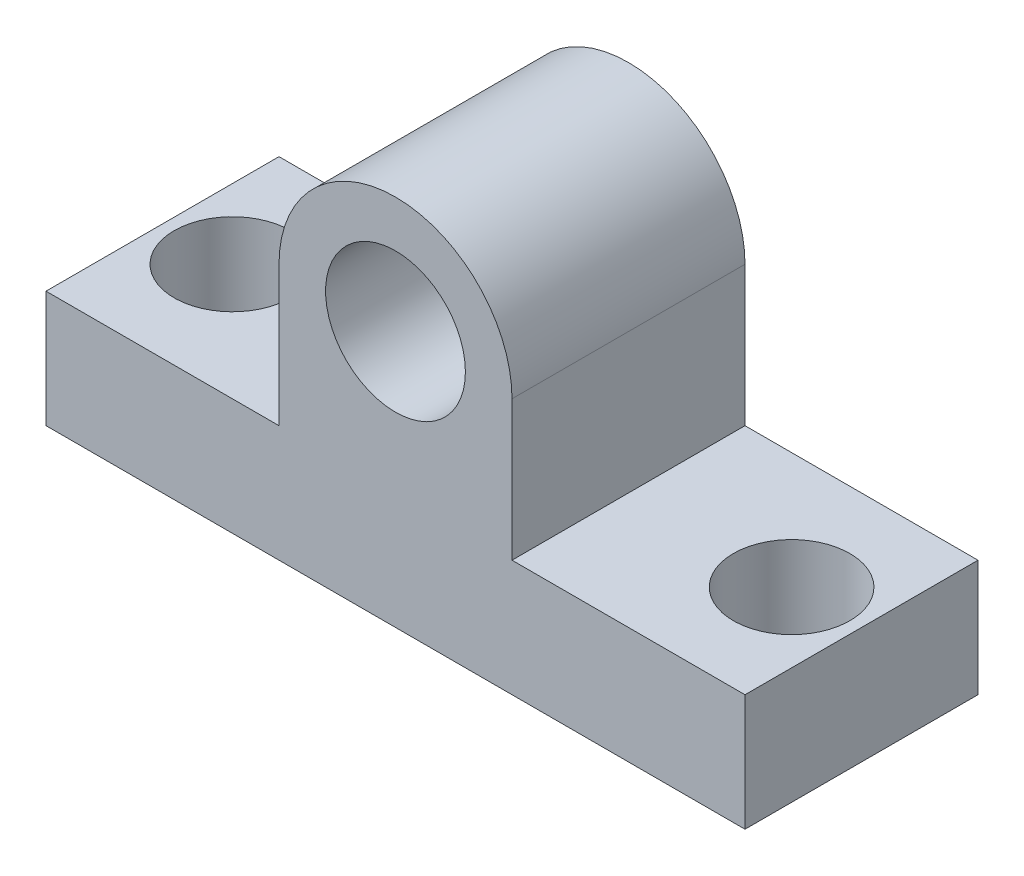
ISO-10303-21;
HEADER;
FILE_DESCRIPTION(('STEP AP214'),'2;1');
FILE_NAME('part.step','',(''),(''),'','','');
FILE_SCHEMA(('AUTOMOTIVE_DESIGN { 1 0 10303 214 1 1 1 1 }'));
ENDSEC;
DATA;
#1=APPLICATION_CONTEXT('core data for automotive mechanical design processes');
#2=APPLICATION_PROTOCOL_DEFINITION('international standard','automotive_design',2000,#1);
#3=PRODUCT_CONTEXT('',#1,'mechanical');
#4=PRODUCT('Part','Part','',(#3));
#5=PRODUCT_RELATED_PRODUCT_CATEGORY('part','',(#4));
#6=PRODUCT_DEFINITION_FORMATION('','',#4);
#7=PRODUCT_DEFINITION_CONTEXT('part definition',#1,'design');
#8=PRODUCT_DEFINITION('design','',#6,#7);
#9=PRODUCT_DEFINITION_SHAPE('','',#8);
#10=(LENGTH_UNIT() NAMED_UNIT(*) SI_UNIT(.MILLI.,.METRE.));
#11=(NAMED_UNIT(*) PLANE_ANGLE_UNIT() SI_UNIT($,.RADIAN.));
#12=(NAMED_UNIT(*) SI_UNIT($,.STERADIAN.) SOLID_ANGLE_UNIT());
#13=UNCERTAINTY_MEASURE_WITH_UNIT(LENGTH_MEASURE(1.E-05),#10,'distance_accuracy_value','');
#14=(GEOMETRIC_REPRESENTATION_CONTEXT(3) GLOBAL_UNCERTAINTY_ASSIGNED_CONTEXT((#13)) GLOBAL_UNIT_ASSIGNED_CONTEXT((#10,
#11,#12)) REPRESENTATION_CONTEXT('',''));
#15=CARTESIAN_POINT('',(0.,0.,0.));
#16=DIRECTION('',(0.,0.,1.));
#17=DIRECTION('',(1.,0.,0.));
#18=AXIS2_PLACEMENT_3D('',#15,#16,#17);
#19=CARTESIAN_POINT('',(0.,6.,10.));
#20=DIRECTION('',(0.,0.,1.));
#21=DIRECTION('',(1.,0.,0.));
#22=AXIS2_PLACEMENT_3D('',#19,#20,#21);
#23=PLANE('',#22);
#24=DIRECTION('',(0.,1.,0.));
#25=VECTOR('',#24,1.);
#26=CARTESIAN_POINT('',(15.,0.,10.));
#27=LINE('',#26,#25);
#28=CARTESIAN_POINT('',(15.,-5.,10.));
#29=VERTEX_POINT('',#28);
#30=CARTESIAN_POINT('',(15.,0.,10.));
#31=VERTEX_POINT('',#30);
#32=EDGE_CURVE('E164',#29,#31,#27,.T.);
#33=ORIENTED_EDGE('',*,*,#32,.T.);
#34=DIRECTION('',(-1.,0.,0.));
#35=VECTOR('',#34,1.);
#36=CARTESIAN_POINT('',(5.,0.,10.));
#37=LINE('',#36,#35);
#38=CARTESIAN_POINT('',(5.,0.,10.));
#39=VERTEX_POINT('',#38);
#40=EDGE_CURVE('E100',#31,#39,#37,.T.);
#41=ORIENTED_EDGE('',*,*,#40,.T.);
#42=DIRECTION('',(0.,1.,0.));
#43=VECTOR('',#42,1.);
#44=CARTESIAN_POINT('',(5.,6.,10.));
#45=LINE('',#44,#43);
#46=CARTESIAN_POINT('',(5.,6.,10.));
#47=VERTEX_POINT('',#46);
#48=EDGE_CURVE('E185',#39,#47,#45,.T.);
#49=ORIENTED_EDGE('',*,*,#48,.T.);
#50=CARTESIAN_POINT('',(0.,6.,10.));
#51=DIRECTION('',(0.,0.,1.));
#52=DIRECTION('',(1.,0.,0.));
#53=AXIS2_PLACEMENT_3D('',#50,#51,#52);
#54=CIRCLE('',#53,5.);
#55=CARTESIAN_POINT('',(-5.,6.,10.));
#56=VERTEX_POINT('',#55);
#57=EDGE_CURVE('E199',#47,#56,#54,.T.);
#58=ORIENTED_EDGE('',*,*,#57,.T.);
#59=DIRECTION('',(0.,-1.,0.));
#60=VECTOR('',#59,1.);
#61=CARTESIAN_POINT('',(-5.,6.,10.));
#62=LINE('',#61,#60);
#63=CARTESIAN_POINT('',(-5.,0.,10.));
#64=VERTEX_POINT('',#63);
#65=EDGE_CURVE('E119',#56,#64,#62,.T.);
#66=ORIENTED_EDGE('',*,*,#65,.T.);
#67=DIRECTION('',(-1.,0.,0.));
#68=VECTOR('',#67,1.);
#69=CARTESIAN_POINT('',(-5.,0.,10.));
#70=LINE('',#69,#68);
#71=CARTESIAN_POINT('',(-15.,0.,10.));
#72=VERTEX_POINT('',#71);
#73=EDGE_CURVE('E113',#64,#72,#70,.T.);
#74=ORIENTED_EDGE('',*,*,#73,.T.);
#75=DIRECTION('',(0.,-1.,0.));
#76=VECTOR('',#75,1.);
#77=CARTESIAN_POINT('',(-15.,0.,10.));
#78=LINE('',#77,#76);
#79=CARTESIAN_POINT('',(-15.,-5.,10.));
#80=VERTEX_POINT('',#79);
#81=EDGE_CURVE('E117',#72,#80,#78,.T.);
#82=ORIENTED_EDGE('',*,*,#81,.T.);
#83=DIRECTION('',(1.,0.,0.));
#84=VECTOR('',#83,1.);
#85=CARTESIAN_POINT('',(15.,-5.,10.));
#86=LINE('',#85,#84);
#87=EDGE_CURVE('E57',#80,#29,#86,.T.);
#88=ORIENTED_EDGE('',*,*,#87,.T.);
#89=EDGE_LOOP('',(#33,#41,#49,#58,#66,#74,#82,#88));
#90=FACE_BOUND('',#89,.T.);
#91=CARTESIAN_POINT('',(0.,6.,10.));
#92=DIRECTION('',(0.,0.,1.));
#93=DIRECTION('',(1.,0.,0.));
#94=AXIS2_PLACEMENT_3D('',#91,#92,#93);
#95=CIRCLE('',#94,3.);
#96=CARTESIAN_POINT('',(3.,6.,10.));
#97=VERTEX_POINT('',#96);
#98=EDGE_CURVE('E146',#97,#97,#95,.T.);
#99=ORIENTED_EDGE('',*,*,#98,.F.);
#100=EDGE_LOOP('',(#99));
#101=FACE_BOUND('',#100,.T.);
#102=ADVANCED_FACE('F39',(#90,#101),#23,.T.);
#103=CARTESIAN_POINT('',(0.,6.,0.));
#104=DIRECTION('',(0.,0.,1.));
#105=DIRECTION('',(1.,0.,0.));
#106=AXIS2_PLACEMENT_3D('',#103,#104,#105);
#107=PLANE('',#106);
#108=DIRECTION('',(0.,1.,0.));
#109=VECTOR('',#108,1.);
#110=CARTESIAN_POINT('',(15.,0.,0.));
#111=LINE('',#110,#109);
#112=CARTESIAN_POINT('',(15.,-5.,0.));
#113=VERTEX_POINT('',#112);
#114=CARTESIAN_POINT('',(15.,0.,0.));
#115=VERTEX_POINT('',#114);
#116=EDGE_CURVE('E141',#113,#115,#111,.T.);
#117=ORIENTED_EDGE('',*,*,#116,.F.);
#118=DIRECTION('',(1.,0.,0.));
#119=VECTOR('',#118,1.);
#120=CARTESIAN_POINT('',(15.,-5.,0.));
#121=LINE('',#120,#119);
#122=CARTESIAN_POINT('',(-15.,-5.,0.));
#123=VERTEX_POINT('',#122);
#124=EDGE_CURVE('E92',#123,#113,#121,.T.);
#125=ORIENTED_EDGE('',*,*,#124,.F.);
#126=DIRECTION('',(0.,-1.,0.));
#127=VECTOR('',#126,1.);
#128=CARTESIAN_POINT('',(-15.,0.,0.));
#129=LINE('',#128,#127);
#130=CARTESIAN_POINT('',(-15.,0.,0.));
#131=VERTEX_POINT('',#130);
#132=EDGE_CURVE('E86',#131,#123,#129,.T.);
#133=ORIENTED_EDGE('',*,*,#132,.F.);
#134=DIRECTION('',(-1.,0.,0.));
#135=VECTOR('',#134,1.);
#136=CARTESIAN_POINT('',(-5.,0.,0.));
#137=LINE('',#136,#135);
#138=CARTESIAN_POINT('',(-5.,0.,0.));
#139=VERTEX_POINT('',#138);
#140=EDGE_CURVE('E128',#139,#131,#137,.T.);
#141=ORIENTED_EDGE('',*,*,#140,.F.);
#142=DIRECTION('',(0.,-1.,0.));
#143=VECTOR('',#142,1.);
#144=CARTESIAN_POINT('',(-5.,6.,0.));
#145=LINE('',#144,#143);
#146=CARTESIAN_POINT('',(-5.,6.,0.));
#147=VERTEX_POINT('',#146);
#148=EDGE_CURVE('E155',#147,#139,#145,.T.);
#149=ORIENTED_EDGE('',*,*,#148,.F.);
#150=CARTESIAN_POINT('',(0.,6.,0.));
#151=DIRECTION('',(0.,0.,1.));
#152=DIRECTION('',(1.,0.,0.));
#153=AXIS2_PLACEMENT_3D('',#150,#151,#152);
#154=CIRCLE('',#153,5.);
#155=CARTESIAN_POINT('',(5.,6.,0.));
#156=VERTEX_POINT('',#155);
#157=EDGE_CURVE('E152',#156,#147,#154,.T.);
#158=ORIENTED_EDGE('',*,*,#157,.F.);
#159=DIRECTION('',(0.,1.,0.));
#160=VECTOR('',#159,1.);
#161=CARTESIAN_POINT('',(5.,6.,0.));
#162=LINE('',#161,#160);
#163=CARTESIAN_POINT('',(5.,0.,0.));
#164=VERTEX_POINT('',#163);
#165=EDGE_CURVE('E149',#164,#156,#162,.T.);
#166=ORIENTED_EDGE('',*,*,#165,.F.);
#167=DIRECTION('',(-1.,0.,0.));
#168=VECTOR('',#167,1.);
#169=CARTESIAN_POINT('',(5.,0.,0.));
#170=LINE('',#169,#168);
#171=EDGE_CURVE('E145',#115,#164,#170,.T.);
#172=ORIENTED_EDGE('',*,*,#171,.F.);
#173=EDGE_LOOP('',(#117,#125,#133,#141,#149,#158,#166,#172));
#174=FACE_BOUND('',#173,.T.);
#175=CARTESIAN_POINT('',(0.,6.,0.));
#176=DIRECTION('',(0.,0.,1.));
#177=DIRECTION('',(1.,0.,0.));
#178=AXIS2_PLACEMENT_3D('',#175,#176,#177);
#179=CIRCLE('',#178,3.);
#180=CARTESIAN_POINT('',(3.,6.,0.));
#181=VERTEX_POINT('',#180);
#182=EDGE_CURVE('E209',#181,#181,#179,.T.);
#183=ORIENTED_EDGE('',*,*,#182,.T.);
#184=EDGE_LOOP('',(#183));
#185=FACE_BOUND('',#184,.T.);
#186=ADVANCED_FACE('F189',(#174,#185),#107,.F.);
#187=CARTESIAN_POINT('',(15.,0.,10.));
#188=DIRECTION('',(-1.,0.,0.));
#189=DIRECTION('',(0.,0.,1.));
#190=AXIS2_PLACEMENT_3D('',#187,#188,#189);
#191=PLANE('',#190);
#192=ORIENTED_EDGE('',*,*,#116,.T.);
#193=DIRECTION('',(0.,0.,-1.));
#194=VECTOR('',#193,1.);
#195=CARTESIAN_POINT('',(15.,0.,10.));
#196=LINE('',#195,#194);
#197=EDGE_CURVE('E11',#31,#115,#196,.T.);
#198=ORIENTED_EDGE('',*,*,#197,.F.);
#199=ORIENTED_EDGE('',*,*,#32,.F.);
#200=DIRECTION('',(0.,0.,-1.));
#201=VECTOR('',#200,1.);
#202=CARTESIAN_POINT('',(15.,-5.,10.));
#203=LINE('',#202,#201);
#204=EDGE_CURVE('E137',#29,#113,#203,.T.);
#205=ORIENTED_EDGE('',*,*,#204,.T.);
#206=EDGE_LOOP('',(#192,#198,#199,#205));
#207=FACE_BOUND('',#206,.T.);
#208=ADVANCED_FACE('F41',(#207),#191,.F.);
#209=CARTESIAN_POINT('',(5.,0.,10.));
#210=DIRECTION('',(0.,-1.,0.));
#211=DIRECTION('',(1.,0.,0.));
#212=AXIS2_PLACEMENT_3D('',#209,#210,#211);
#213=PLANE('',#212);
#214=CARTESIAN_POINT('',(12.,0.,5.));
#215=DIRECTION('',(0.,1.,0.));
#216=DIRECTION('',(-1.,0.,0.));
#217=AXIS2_PLACEMENT_3D('',#214,#215,#216);
#218=CIRCLE('',#217,2.5);
#219=CARTESIAN_POINT('',(9.5,0.,5.));
#220=VERTEX_POINT('',#219);
#221=EDGE_CURVE('E225',#220,#220,#218,.T.);
#222=ORIENTED_EDGE('',*,*,#221,.F.);
#223=EDGE_LOOP('',(#222));
#224=FACE_BOUND('',#223,.T.);
#225=ORIENTED_EDGE('',*,*,#171,.T.);
#226=DIRECTION('',(0.,0.,-1.));
#227=VECTOR('',#226,1.);
#228=CARTESIAN_POINT('',(5.,0.,10.));
#229=LINE('',#228,#227);
#230=EDGE_CURVE('E49',#39,#164,#229,.T.);
#231=ORIENTED_EDGE('',*,*,#230,.F.);
#232=ORIENTED_EDGE('',*,*,#40,.F.);
#233=ORIENTED_EDGE('',*,*,#197,.T.);
#234=EDGE_LOOP('',(#225,#231,#232,#233));
#235=FACE_BOUND('',#234,.T.);
#236=ADVANCED_FACE('F243',(#224,#235),#213,.F.);
#237=CARTESIAN_POINT('',(5.,6.,10.));
#238=DIRECTION('',(-1.,0.,0.));
#239=DIRECTION('',(0.,-1.,0.));
#240=AXIS2_PLACEMENT_3D('',#237,#238,#239);
#241=PLANE('',#240);
#242=ORIENTED_EDGE('',*,*,#165,.T.);
#243=DIRECTION('',(0.,0.,-1.));
#244=VECTOR('',#243,1.);
#245=CARTESIAN_POINT('',(5.,6.,10.));
#246=LINE('',#245,#244);
#247=EDGE_CURVE('E175',#47,#156,#246,.T.);
#248=ORIENTED_EDGE('',*,*,#247,.F.);
#249=ORIENTED_EDGE('',*,*,#48,.F.);
#250=ORIENTED_EDGE('',*,*,#230,.T.);
#251=EDGE_LOOP('',(#242,#248,#249,#250));
#252=FACE_BOUND('',#251,.T.);
#253=ADVANCED_FACE('F183',(#252),#241,.F.);
#254=CARTESIAN_POINT('',(0.,6.,10.));
#255=DIRECTION('',(0.,0.,-1.));
#256=DIRECTION('',(-1.,0.,0.));
#257=AXIS2_PLACEMENT_3D('',#254,#255,#256);
#258=CYLINDRICAL_SURFACE('',#257,5.);
#259=ORIENTED_EDGE('',*,*,#157,.T.);
#260=DIRECTION('',(0.,0.,-1.));
#261=VECTOR('',#260,1.);
#262=CARTESIAN_POINT('',(-5.,6.,10.));
#263=LINE('',#262,#261);
#264=EDGE_CURVE('E171',#56,#147,#263,.T.);
#265=ORIENTED_EDGE('',*,*,#264,.F.);
#266=ORIENTED_EDGE('',*,*,#57,.F.);
#267=ORIENTED_EDGE('',*,*,#247,.T.);
#268=EDGE_LOOP('',(#259,#265,#266,#267));
#269=FACE_BOUND('',#268,.T.);
#270=ADVANCED_FACE('F194',(#269),#258,.T.);
#271=CARTESIAN_POINT('',(-5.,6.,10.));
#272=DIRECTION('',(1.,0.,0.));
#273=DIRECTION('',(0.,1.,0.));
#274=AXIS2_PLACEMENT_3D('',#271,#272,#273);
#275=PLANE('',#274);
#276=ORIENTED_EDGE('',*,*,#148,.T.);
#277=DIRECTION('',(0.,0.,-1.));
#278=VECTOR('',#277,1.);
#279=CARTESIAN_POINT('',(-5.,0.,10.));
#280=LINE('',#279,#278);
#281=EDGE_CURVE('E130',#64,#139,#280,.T.);
#282=ORIENTED_EDGE('',*,*,#281,.F.);
#283=ORIENTED_EDGE('',*,*,#65,.F.);
#284=ORIENTED_EDGE('',*,*,#264,.T.);
#285=EDGE_LOOP('',(#276,#282,#283,#284));
#286=FACE_BOUND('',#285,.T.);
#287=ADVANCED_FACE('F197',(#286),#275,.F.);
#288=CARTESIAN_POINT('',(-5.,0.,10.));
#289=DIRECTION('',(0.,-1.,0.));
#290=DIRECTION('',(1.,0.,0.));
#291=AXIS2_PLACEMENT_3D('',#288,#289,#290);
#292=PLANE('',#291);
#293=CARTESIAN_POINT('',(-12.,0.,5.));
#294=DIRECTION('',(0.,1.,0.));
#295=DIRECTION('',(-1.,0.,0.));
#296=AXIS2_PLACEMENT_3D('',#293,#294,#295);
#297=CIRCLE('',#296,2.5);
#298=CARTESIAN_POINT('',(-14.5,0.,5.));
#299=VERTEX_POINT('',#298);
#300=EDGE_CURVE('E217',#299,#299,#297,.T.);
#301=ORIENTED_EDGE('',*,*,#300,.F.);
#302=EDGE_LOOP('',(#301));
#303=FACE_BOUND('',#302,.T.);
#304=ORIENTED_EDGE('',*,*,#140,.T.);
#305=DIRECTION('',(0.,0.,-1.));
#306=VECTOR('',#305,1.);
#307=CARTESIAN_POINT('',(-15.,0.,10.));
#308=LINE('',#307,#306);
#309=EDGE_CURVE('E125',#72,#131,#308,.T.);
#310=ORIENTED_EDGE('',*,*,#309,.F.);
#311=ORIENTED_EDGE('',*,*,#73,.F.);
#312=ORIENTED_EDGE('',*,*,#281,.T.);
#313=EDGE_LOOP('',(#304,#310,#311,#312));
#314=FACE_BOUND('',#313,.T.);
#315=ADVANCED_FACE('F126',(#303,#314),#292,.F.);
#316=CARTESIAN_POINT('',(-15.,0.,10.));
#317=DIRECTION('',(1.,0.,0.));
#318=DIRECTION('',(0.,0.,-1.));
#319=AXIS2_PLACEMENT_3D('',#316,#317,#318);
#320=PLANE('',#319);
#321=ORIENTED_EDGE('',*,*,#132,.T.);
#322=DIRECTION('',(0.,0.,-1.));
#323=VECTOR('',#322,1.);
#324=CARTESIAN_POINT('',(-15.,-5.,10.));
#325=LINE('',#324,#323);
#326=EDGE_CURVE('E131',#80,#123,#325,.T.);
#327=ORIENTED_EDGE('',*,*,#326,.F.);
#328=ORIENTED_EDGE('',*,*,#81,.F.);
#329=ORIENTED_EDGE('',*,*,#309,.T.);
#330=EDGE_LOOP('',(#321,#327,#328,#329));
#331=FACE_BOUND('',#330,.T.);
#332=ADVANCED_FACE('F133',(#331),#320,.F.);
#333=CARTESIAN_POINT('',(15.,-5.,10.));
#334=DIRECTION('',(0.,1.,0.));
#335=DIRECTION('',(0.,0.,1.));
#336=AXIS2_PLACEMENT_3D('',#333,#334,#335);
#337=PLANE('',#336);
#338=CARTESIAN_POINT('',(12.,-5.,5.));
#339=DIRECTION('',(0.,1.,0.));
#340=DIRECTION('',(-1.,0.,0.));
#341=AXIS2_PLACEMENT_3D('',#338,#339,#340);
#342=CIRCLE('',#341,2.5);
#343=CARTESIAN_POINT('',(9.5,-5.,5.));
#344=VERTEX_POINT('',#343);
#345=EDGE_CURVE('E221',#344,#344,#342,.T.);
#346=ORIENTED_EDGE('',*,*,#345,.T.);
#347=EDGE_LOOP('',(#346));
#348=FACE_BOUND('',#347,.T.);
#349=CARTESIAN_POINT('',(-12.,-5.,5.));
#350=DIRECTION('',(0.,1.,0.));
#351=DIRECTION('',(-1.,0.,0.));
#352=AXIS2_PLACEMENT_3D('',#349,#350,#351);
#353=CIRCLE('',#352,2.5);
#354=CARTESIAN_POINT('',(-14.5,-5.,5.));
#355=VERTEX_POINT('',#354);
#356=EDGE_CURVE('E213',#355,#355,#353,.T.);
#357=ORIENTED_EDGE('',*,*,#356,.T.);
#358=EDGE_LOOP('',(#357));
#359=FACE_BOUND('',#358,.T.);
#360=ORIENTED_EDGE('',*,*,#124,.T.);
#361=ORIENTED_EDGE('',*,*,#204,.F.);
#362=ORIENTED_EDGE('',*,*,#87,.F.);
#363=ORIENTED_EDGE('',*,*,#326,.T.);
#364=EDGE_LOOP('',(#360,#361,#362,#363));
#365=FACE_BOUND('',#364,.T.);
#366=ADVANCED_FACE('F233',(#348,#359,#365),#337,.F.);
#367=CARTESIAN_POINT('',(0.,6.,10.));
#368=DIRECTION('',(0.,0.,-1.));
#369=DIRECTION('',(-1.,0.,0.));
#370=AXIS2_PLACEMENT_3D('',#367,#368,#369);
#371=CYLINDRICAL_SURFACE('',#370,3.);
#372=ORIENTED_EDGE('',*,*,#98,.T.);
#373=EDGE_LOOP('',(#372));
#374=FACE_BOUND('',#373,.T.);
#375=ORIENTED_EDGE('',*,*,#182,.F.);
#376=EDGE_LOOP('',(#375));
#377=FACE_BOUND('',#376,.T.);
#378=ADVANCED_FACE('F249',(#374,#377),#371,.F.);
#379=CARTESIAN_POINT('',(-12.,-5.,5.));
#380=DIRECTION('',(0.,1.,0.));
#381=DIRECTION('',(-1.,0.,0.));
#382=AXIS2_PLACEMENT_3D('',#379,#380,#381);
#383=CYLINDRICAL_SURFACE('',#382,2.5);
#384=ORIENTED_EDGE('',*,*,#356,.F.);
#385=EDGE_LOOP('',(#384));
#386=FACE_BOUND('',#385,.T.);
#387=ORIENTED_EDGE('',*,*,#300,.T.);
#388=EDGE_LOOP('',(#387));
#389=FACE_BOUND('',#388,.T.);
#390=ADVANCED_FACE('F239',(#386,#389),#383,.F.);
#391=CARTESIAN_POINT('',(12.,-5.,5.));
#392=DIRECTION('',(0.,1.,0.));
#393=DIRECTION('',(-1.,0.,0.));
#394=AXIS2_PLACEMENT_3D('',#391,#392,#393);
#395=CYLINDRICAL_SURFACE('',#394,2.5);
#396=ORIENTED_EDGE('',*,*,#345,.F.);
#397=EDGE_LOOP('',(#396));
#398=FACE_BOUND('',#397,.T.);
#399=ORIENTED_EDGE('',*,*,#221,.T.);
#400=EDGE_LOOP('',(#399));
#401=FACE_BOUND('',#400,.T.);
#402=ADVANCED_FACE('F236',(#398,#401),#395,.F.);
#403=CLOSED_SHELL('',(#102,#186,#208,#236,#253,#270,#287,#315,#332,#366,#378,#390,#402));
#404=MANIFOLD_SOLID_BREP('B2',#403);
#405=ADVANCED_BREP_SHAPE_REPRESENTATION('',(#18,#404),#14);
#406=SHAPE_DEFINITION_REPRESENTATION(#9,#405);
ENDSEC;
END-ISO-10303-21;
